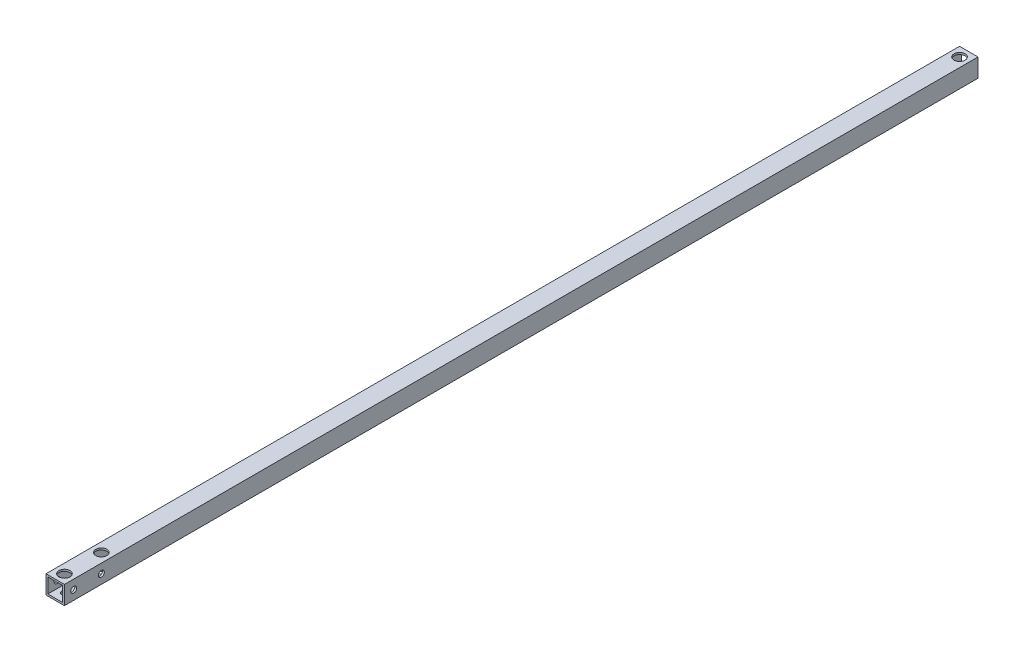
ISO-10303-21;
HEADER;
FILE_DESCRIPTION(('STEP AP214'),'2;1');
FILE_NAME('part.step','',(''),(''),'','','');
FILE_SCHEMA(('AUTOMOTIVE_DESIGN { 1 0 10303 214 1 1 1 1 }'));
ENDSEC;
DATA;
#1=APPLICATION_CONTEXT('core data for automotive mechanical design processes');
#2=APPLICATION_PROTOCOL_DEFINITION('international standard','automotive_design',2000,#1);
#3=PRODUCT_CONTEXT('',#1,'mechanical');
#4=PRODUCT('Part','Part','',(#3));
#5=PRODUCT_RELATED_PRODUCT_CATEGORY('part','',(#4));
#6=PRODUCT_DEFINITION_FORMATION('','',#4);
#7=PRODUCT_DEFINITION_CONTEXT('part definition',#1,'design');
#8=PRODUCT_DEFINITION('design','',#6,#7);
#9=PRODUCT_DEFINITION_SHAPE('','',#8);
#10=(LENGTH_UNIT() NAMED_UNIT(*) SI_UNIT(.MILLI.,.METRE.));
#11=(NAMED_UNIT(*) PLANE_ANGLE_UNIT() SI_UNIT($,.RADIAN.));
#12=(NAMED_UNIT(*) SI_UNIT($,.STERADIAN.) SOLID_ANGLE_UNIT());
#13=UNCERTAINTY_MEASURE_WITH_UNIT(LENGTH_MEASURE(1.E-05),#10,'distance_accuracy_value','');
#14=(GEOMETRIC_REPRESENTATION_CONTEXT(3) GLOBAL_UNCERTAINTY_ASSIGNED_CONTEXT((#13)) GLOBAL_UNIT_ASSIGNED_CONTEXT((#10,
#11,#12)) REPRESENTATION_CONTEXT('',''));
#15=CARTESIAN_POINT('',(0.,0.,0.));
#16=DIRECTION('',(0.,0.,1.));
#17=DIRECTION('',(1.,0.,0.));
#18=AXIS2_PLACEMENT_3D('',#15,#16,#17);
#19=CARTESIAN_POINT('',(0.,0.,495.));
#20=DIRECTION('',(0.,0.,1.));
#21=DIRECTION('',(1.,0.,0.));
#22=AXIS2_PLACEMENT_3D('',#19,#20,#21);
#23=PLANE('',#22);
#24=DIRECTION('',(0.,-1.,0.));
#25=VECTOR('',#24,1.);
#26=CARTESIAN_POINT('',(-5.,5.,495.));
#27=LINE('',#26,#25);
#28=CARTESIAN_POINT('',(-5.,5.,495.));
#29=VERTEX_POINT('',#28);
#30=CARTESIAN_POINT('',(-5.,-5.,495.));
#31=VERTEX_POINT('',#30);
#32=EDGE_CURVE('E166',#29,#31,#27,.T.);
#33=ORIENTED_EDGE('',*,*,#32,.T.);
#34=DIRECTION('',(1.,0.,0.));
#35=VECTOR('',#34,1.);
#36=CARTESIAN_POINT('',(5.,-5.,495.));
#37=LINE('',#36,#35);
#38=CARTESIAN_POINT('',(5.,-5.,495.));
#39=VERTEX_POINT('',#38);
#40=EDGE_CURVE('E169',#31,#39,#37,.T.);
#41=ORIENTED_EDGE('',*,*,#40,.T.);
#42=DIRECTION('',(0.,1.,0.));
#43=VECTOR('',#42,1.);
#44=CARTESIAN_POINT('',(5.,5.,495.));
#45=LINE('',#44,#43);
#46=CARTESIAN_POINT('',(5.,5.,495.));
#47=VERTEX_POINT('',#46);
#48=EDGE_CURVE('E172',#39,#47,#45,.T.);
#49=ORIENTED_EDGE('',*,*,#48,.T.);
#50=DIRECTION('',(-1.,0.,0.));
#51=VECTOR('',#50,1.);
#52=CARTESIAN_POINT('',(5.,5.,495.));
#53=LINE('',#52,#51);
#54=EDGE_CURVE('E174',#47,#29,#53,.T.);
#55=ORIENTED_EDGE('',*,*,#54,.T.);
#56=EDGE_LOOP('',(#33,#41,#49,#55));
#57=FACE_BOUND('',#56,.T.);
#58=DIRECTION('',(1.,0.,0.));
#59=VECTOR('',#58,1.);
#60=CARTESIAN_POINT('',(0.,-4.,495.));
#61=LINE('',#60,#59);
#62=CARTESIAN_POINT('',(-4.,-4.,495.));
#63=VERTEX_POINT('',#62);
#64=CARTESIAN_POINT('',(4.,-4.,495.));
#65=VERTEX_POINT('',#64);
#66=EDGE_CURVE('E136',#63,#65,#61,.T.);
#67=ORIENTED_EDGE('',*,*,#66,.F.);
#68=DIRECTION('',(0.,-1.,0.));
#69=VECTOR('',#68,1.);
#70=CARTESIAN_POINT('',(-4.,0.,495.));
#71=LINE('',#70,#69);
#72=CARTESIAN_POINT('',(-4.,4.,495.));
#73=VERTEX_POINT('',#72);
#74=EDGE_CURVE('E128',#73,#63,#71,.T.);
#75=ORIENTED_EDGE('',*,*,#74,.F.);
#76=DIRECTION('',(-1.,0.,0.));
#77=VECTOR('',#76,1.);
#78=CARTESIAN_POINT('',(0.,4.,495.));
#79=LINE('',#78,#77);
#80=CARTESIAN_POINT('',(4.,4.,495.));
#81=VERTEX_POINT('',#80);
#82=EDGE_CURVE('E150',#81,#73,#79,.T.);
#83=ORIENTED_EDGE('',*,*,#82,.F.);
#84=DIRECTION('',(0.,1.,0.));
#85=VECTOR('',#84,1.);
#86=CARTESIAN_POINT('',(4.,0.,495.));
#87=LINE('',#86,#85);
#88=EDGE_CURVE('E148',#65,#81,#87,.T.);
#89=ORIENTED_EDGE('',*,*,#88,.F.);
#90=EDGE_LOOP('',(#67,#75,#83,#89));
#91=FACE_BOUND('',#90,.T.);
#92=ADVANCED_FACE('F61',(#57,#91),#23,.T.);
#93=CARTESIAN_POINT('',(0.,0.,0.));
#94=DIRECTION('',(0.,0.,1.));
#95=DIRECTION('',(1.,0.,0.));
#96=AXIS2_PLACEMENT_3D('',#93,#94,#95);
#97=PLANE('',#96);
#98=DIRECTION('',(0.,-1.,0.));
#99=VECTOR('',#98,1.);
#100=CARTESIAN_POINT('',(-5.,5.,0.));
#101=LINE('',#100,#99);
#102=CARTESIAN_POINT('',(-5.,5.,0.));
#103=VERTEX_POINT('',#102);
#104=CARTESIAN_POINT('',(-5.,-5.,0.));
#105=VERTEX_POINT('',#104);
#106=EDGE_CURVE('E144',#103,#105,#101,.T.);
#107=ORIENTED_EDGE('',*,*,#106,.F.);
#108=DIRECTION('',(-1.,0.,0.));
#109=VECTOR('',#108,1.);
#110=CARTESIAN_POINT('',(5.,5.,0.));
#111=LINE('',#110,#109);
#112=CARTESIAN_POINT('',(5.,5.,0.));
#113=VERTEX_POINT('',#112);
#114=EDGE_CURVE('E170',#113,#103,#111,.T.);
#115=ORIENTED_EDGE('',*,*,#114,.F.);
#116=DIRECTION('',(0.,1.,0.));
#117=VECTOR('',#116,1.);
#118=CARTESIAN_POINT('',(5.,5.,0.));
#119=LINE('',#118,#117);
#120=CARTESIAN_POINT('',(5.,-5.,0.));
#121=VERTEX_POINT('',#120);
#122=EDGE_CURVE('E181',#121,#113,#119,.T.);
#123=ORIENTED_EDGE('',*,*,#122,.F.);
#124=DIRECTION('',(1.,0.,0.));
#125=VECTOR('',#124,1.);
#126=CARTESIAN_POINT('',(5.,-5.,0.));
#127=LINE('',#126,#125);
#128=EDGE_CURVE('E179',#105,#121,#127,.T.);
#129=ORIENTED_EDGE('',*,*,#128,.F.);
#130=EDGE_LOOP('',(#107,#115,#123,#129));
#131=FACE_BOUND('',#130,.T.);
#132=DIRECTION('',(0.,-1.,0.));
#133=VECTOR('',#132,1.);
#134=CARTESIAN_POINT('',(-4.,0.,0.));
#135=LINE('',#134,#133);
#136=CARTESIAN_POINT('',(-4.,4.,0.));
#137=VERTEX_POINT('',#136);
#138=CARTESIAN_POINT('',(-4.,-4.,0.));
#139=VERTEX_POINT('',#138);
#140=EDGE_CURVE('E86',#137,#139,#135,.T.);
#141=ORIENTED_EDGE('',*,*,#140,.T.);
#142=DIRECTION('',(1.,0.,0.));
#143=VECTOR('',#142,1.);
#144=CARTESIAN_POINT('',(0.,-4.,0.));
#145=LINE('',#144,#143);
#146=CARTESIAN_POINT('',(4.,-4.,0.));
#147=VERTEX_POINT('',#146);
#148=EDGE_CURVE('E143',#139,#147,#145,.T.);
#149=ORIENTED_EDGE('',*,*,#148,.T.);
#150=DIRECTION('',(0.,1.,0.));
#151=VECTOR('',#150,1.);
#152=CARTESIAN_POINT('',(4.,0.,0.));
#153=LINE('',#152,#151);
#154=CARTESIAN_POINT('',(4.,4.,0.));
#155=VERTEX_POINT('',#154);
#156=EDGE_CURVE('E158',#147,#155,#153,.T.);
#157=ORIENTED_EDGE('',*,*,#156,.T.);
#158=DIRECTION('',(-1.,0.,0.));
#159=VECTOR('',#158,1.);
#160=CARTESIAN_POINT('',(0.,4.,0.));
#161=LINE('',#160,#159);
#162=EDGE_CURVE('E137',#155,#137,#161,.T.);
#163=ORIENTED_EDGE('',*,*,#162,.T.);
#164=EDGE_LOOP('',(#141,#149,#157,#163));
#165=FACE_BOUND('',#164,.T.);
#166=ADVANCED_FACE('F283',(#131,#165),#97,.F.);
#167=CARTESIAN_POINT('',(-5.,5.,495.));
#168=DIRECTION('',(1.,0.,0.));
#169=DIRECTION('',(0.,1.,0.));
#170=AXIS2_PLACEMENT_3D('',#167,#168,#169);
#171=PLANE('',#170);
#172=CARTESIAN_POINT('',(-5.,0.,490.));
#173=DIRECTION('',(1.,0.,0.));
#174=DIRECTION('',(0.,1.,0.));
#175=AXIS2_PLACEMENT_3D('',#172,#173,#174);
#176=CIRCLE('',#175,1.59999999999996);
#177=CARTESIAN_POINT('',(-5.,1.59999999999996,490.));
#178=VERTEX_POINT('',#177);
#179=EDGE_CURVE('E193',#178,#178,#176,.T.);
#180=ORIENTED_EDGE('',*,*,#179,.T.);
#181=EDGE_LOOP('',(#180));
#182=FACE_BOUND('',#181,.T.);
#183=CARTESIAN_POINT('',(-5.,0.,475.));
#184=DIRECTION('',(1.,0.,0.));
#185=DIRECTION('',(0.,1.,0.));
#186=AXIS2_PLACEMENT_3D('',#183,#184,#185);
#187=CIRCLE('',#186,1.59999999999996);
#188=CARTESIAN_POINT('',(-5.,1.59999999999996,475.));
#189=VERTEX_POINT('',#188);
#190=EDGE_CURVE('E204',#189,#189,#187,.T.);
#191=ORIENTED_EDGE('',*,*,#190,.T.);
#192=EDGE_LOOP('',(#191));
#193=FACE_BOUND('',#192,.T.);
#194=ORIENTED_EDGE('',*,*,#106,.T.);
#195=DIRECTION('',(0.,0.,-1.));
#196=VECTOR('',#195,1.);
#197=CARTESIAN_POINT('',(-5.,-5.,495.));
#198=LINE('',#197,#196);
#199=EDGE_CURVE('E12',#31,#105,#198,.T.);
#200=ORIENTED_EDGE('',*,*,#199,.F.);
#201=ORIENTED_EDGE('',*,*,#32,.F.);
#202=DIRECTION('',(0.,0.,-1.));
#203=VECTOR('',#202,1.);
#204=CARTESIAN_POINT('',(-5.,5.,495.));
#205=LINE('',#204,#203);
#206=EDGE_CURVE('E176',#29,#103,#205,.T.);
#207=ORIENTED_EDGE('',*,*,#206,.T.);
#208=EDGE_LOOP('',(#194,#200,#201,#207));
#209=FACE_BOUND('',#208,.T.);
#210=ADVANCED_FACE('F63',(#182,#193,#209),#171,.F.);
#211=CARTESIAN_POINT('',(5.,-5.,495.));
#212=DIRECTION('',(0.,1.,0.));
#213=DIRECTION('',(-1.,0.,0.));
#214=AXIS2_PLACEMENT_3D('',#211,#212,#213);
#215=PLANE('',#214);
#216=CARTESIAN_POINT('',(0.,-5.00000000000001,5.));
#217=DIRECTION('',(0.,1.,0.));
#218=DIRECTION('',(-1.,0.,0.));
#219=AXIS2_PLACEMENT_3D('',#216,#217,#218);
#220=CIRCLE('',#219,1.6);
#221=CARTESIAN_POINT('',(-1.6,-5.00000000000001,5.));
#222=VERTEX_POINT('',#221);
#223=EDGE_CURVE('E234',#222,#222,#220,.T.);
#224=ORIENTED_EDGE('',*,*,#223,.T.);
#225=EDGE_LOOP('',(#224));
#226=FACE_BOUND('',#225,.T.);
#227=CARTESIAN_POINT('',(0.,-5.00000000000001,490.));
#228=DIRECTION('',(0.,1.,0.));
#229=DIRECTION('',(-1.,0.,0.));
#230=AXIS2_PLACEMENT_3D('',#227,#228,#229);
#231=CIRCLE('',#230,1.59999999999999);
#232=CARTESIAN_POINT('',(-1.59999999999993,-5.00000000000001,490.));
#233=VERTEX_POINT('',#232);
#234=EDGE_CURVE('E238',#233,#233,#231,.T.);
#235=ORIENTED_EDGE('',*,*,#234,.T.);
#236=EDGE_LOOP('',(#235));
#237=FACE_BOUND('',#236,.T.);
#238=CARTESIAN_POINT('',(0.,-5.00000000000001,470.));
#239=DIRECTION('',(0.,1.,0.));
#240=DIRECTION('',(-1.,0.,0.));
#241=AXIS2_PLACEMENT_3D('',#238,#239,#240);
#242=CIRCLE('',#241,1.59999999999999);
#243=CARTESIAN_POINT('',(-1.59999999999993,-5.00000000000001,470.));
#244=VERTEX_POINT('',#243);
#245=EDGE_CURVE('E219',#244,#244,#242,.T.);
#246=ORIENTED_EDGE('',*,*,#245,.T.);
#247=EDGE_LOOP('',(#246));
#248=FACE_BOUND('',#247,.T.);
#249=ORIENTED_EDGE('',*,*,#128,.T.);
#250=DIRECTION('',(0.,0.,-1.));
#251=VECTOR('',#250,1.);
#252=CARTESIAN_POINT('',(5.,-5.,495.));
#253=LINE('',#252,#251);
#254=EDGE_CURVE('E70',#39,#121,#253,.T.);
#255=ORIENTED_EDGE('',*,*,#254,.F.);
#256=ORIENTED_EDGE('',*,*,#40,.F.);
#257=ORIENTED_EDGE('',*,*,#199,.T.);
#258=EDGE_LOOP('',(#249,#255,#256,#257));
#259=FACE_BOUND('',#258,.T.);
#260=ADVANCED_FACE('F269',(#226,#237,#248,#259),#215,.F.);
#261=CARTESIAN_POINT('',(5.,5.,495.));
#262=DIRECTION('',(-1.,0.,0.));
#263=DIRECTION('',(0.,-1.,0.));
#264=AXIS2_PLACEMENT_3D('',#261,#262,#263);
#265=PLANE('',#264);
#266=CARTESIAN_POINT('',(5.,0.,490.));
#267=DIRECTION('',(1.,0.,0.));
#268=DIRECTION('',(0.,1.,0.));
#269=AXIS2_PLACEMENT_3D('',#266,#267,#268);
#270=CIRCLE('',#269,1.59999999999996);
#271=CARTESIAN_POINT('',(5.,1.59999999999997,490.));
#272=VERTEX_POINT('',#271);
#273=EDGE_CURVE('E199',#272,#272,#270,.T.);
#274=ORIENTED_EDGE('',*,*,#273,.F.);
#275=EDGE_LOOP('',(#274));
#276=FACE_BOUND('',#275,.T.);
#277=CARTESIAN_POINT('',(5.,0.,475.));
#278=DIRECTION('',(1.,0.,0.));
#279=DIRECTION('',(0.,1.,0.));
#280=AXIS2_PLACEMENT_3D('',#277,#278,#279);
#281=CIRCLE('',#280,1.59999999999996);
#282=CARTESIAN_POINT('',(5.,1.59999999999997,475.));
#283=VERTEX_POINT('',#282);
#284=EDGE_CURVE('E209',#283,#283,#281,.T.);
#285=ORIENTED_EDGE('',*,*,#284,.F.);
#286=EDGE_LOOP('',(#285));
#287=FACE_BOUND('',#286,.T.);
#288=ORIENTED_EDGE('',*,*,#122,.T.);
#289=DIRECTION('',(0.,0.,-1.));
#290=VECTOR('',#289,1.);
#291=CARTESIAN_POINT('',(5.,5.,495.));
#292=LINE('',#291,#290);
#293=EDGE_CURVE('E186',#47,#113,#292,.T.);
#294=ORIENTED_EDGE('',*,*,#293,.F.);
#295=ORIENTED_EDGE('',*,*,#48,.F.);
#296=ORIENTED_EDGE('',*,*,#254,.T.);
#297=EDGE_LOOP('',(#288,#294,#295,#296));
#298=FACE_BOUND('',#297,.T.);
#299=ADVANCED_FACE('F272',(#276,#287,#298),#265,.F.);
#300=CARTESIAN_POINT('',(5.,5.,495.));
#301=DIRECTION('',(0.,-1.,0.));
#302=DIRECTION('',(1.,0.,0.));
#303=AXIS2_PLACEMENT_3D('',#300,#301,#302);
#304=PLANE('',#303);
#305=CARTESIAN_POINT('',(0.,5.,5.));
#306=DIRECTION('',(0.,1.,0.));
#307=DIRECTION('',(-1.,0.,0.));
#308=AXIS2_PLACEMENT_3D('',#305,#306,#307);
#309=CIRCLE('',#308,3.);
#310=CARTESIAN_POINT('',(-3.,5.,5.));
#311=VERTEX_POINT('',#310);
#312=EDGE_CURVE('E216',#311,#311,#309,.T.);
#313=ORIENTED_EDGE('',*,*,#312,.F.);
#314=EDGE_LOOP('',(#313));
#315=FACE_BOUND('',#314,.T.);
#316=CARTESIAN_POINT('',(0.,5.,490.));
#317=DIRECTION('',(0.,1.,0.));
#318=DIRECTION('',(-1.,0.,0.));
#319=AXIS2_PLACEMENT_3D('',#316,#317,#318);
#320=CIRCLE('',#319,3.);
#321=CARTESIAN_POINT('',(-2.99999999999994,5.,490.));
#322=VERTEX_POINT('',#321);
#323=EDGE_CURVE('E223',#322,#322,#320,.T.);
#324=ORIENTED_EDGE('',*,*,#323,.F.);
#325=EDGE_LOOP('',(#324));
#326=FACE_BOUND('',#325,.T.);
#327=CARTESIAN_POINT('',(0.,5.,470.));
#328=DIRECTION('',(0.,1.,0.));
#329=DIRECTION('',(-1.,0.,0.));
#330=AXIS2_PLACEMENT_3D('',#327,#328,#329);
#331=CIRCLE('',#330,3.);
#332=CARTESIAN_POINT('',(-2.99999999999995,5.,470.));
#333=VERTEX_POINT('',#332);
#334=EDGE_CURVE('E229',#333,#333,#331,.T.);
#335=ORIENTED_EDGE('',*,*,#334,.F.);
#336=EDGE_LOOP('',(#335));
#337=FACE_BOUND('',#336,.T.);
#338=ORIENTED_EDGE('',*,*,#114,.T.);
#339=ORIENTED_EDGE('',*,*,#206,.F.);
#340=ORIENTED_EDGE('',*,*,#54,.F.);
#341=ORIENTED_EDGE('',*,*,#293,.T.);
#342=EDGE_LOOP('',(#338,#339,#340,#341));
#343=FACE_BOUND('',#342,.T.);
#344=ADVANCED_FACE('F287',(#315,#326,#337,#343),#304,.F.);
#345=CARTESIAN_POINT('',(-4.,0.,495.));
#346=DIRECTION('',(1.,0.,0.));
#347=DIRECTION('',(0.,1.,0.));
#348=AXIS2_PLACEMENT_3D('',#345,#346,#347);
#349=PLANE('',#348);
#350=CARTESIAN_POINT('',(-4.,0.,490.));
#351=DIRECTION('',(1.,0.,0.));
#352=DIRECTION('',(0.,1.,0.));
#353=AXIS2_PLACEMENT_3D('',#350,#351,#352);
#354=CIRCLE('',#353,1.59999999999996);
#355=CARTESIAN_POINT('',(-4.,1.59999999999996,490.));
#356=VERTEX_POINT('',#355);
#357=EDGE_CURVE('E212',#356,#356,#354,.T.);
#358=ORIENTED_EDGE('',*,*,#357,.F.);
#359=EDGE_LOOP('',(#358));
#360=FACE_BOUND('',#359,.T.);
#361=CARTESIAN_POINT('',(-4.,0.,475.));
#362=DIRECTION('',(1.,0.,0.));
#363=DIRECTION('',(0.,1.,0.));
#364=AXIS2_PLACEMENT_3D('',#361,#362,#363);
#365=CIRCLE('',#364,1.59999999999996);
#366=CARTESIAN_POINT('',(-4.,1.59999999999996,475.));
#367=VERTEX_POINT('',#366);
#368=EDGE_CURVE('E192',#367,#367,#365,.T.);
#369=ORIENTED_EDGE('',*,*,#368,.F.);
#370=EDGE_LOOP('',(#369));
#371=FACE_BOUND('',#370,.T.);
#372=ORIENTED_EDGE('',*,*,#140,.F.);
#373=DIRECTION('',(0.,0.,-1.));
#374=VECTOR('',#373,1.);
#375=CARTESIAN_POINT('',(-4.,4.,495.));
#376=LINE('',#375,#374);
#377=EDGE_CURVE('E132',#73,#137,#376,.T.);
#378=ORIENTED_EDGE('',*,*,#377,.F.);
#379=ORIENTED_EDGE('',*,*,#74,.T.);
#380=DIRECTION('',(0.,0.,-1.));
#381=VECTOR('',#380,1.);
#382=CARTESIAN_POINT('',(-4.,-4.,495.));
#383=LINE('',#382,#381);
#384=EDGE_CURVE('E131',#63,#139,#383,.T.);
#385=ORIENTED_EDGE('',*,*,#384,.T.);
#386=EDGE_LOOP('',(#372,#378,#379,#385));
#387=FACE_BOUND('',#386,.T.);
#388=ADVANCED_FACE('F130',(#360,#371,#387),#349,.T.);
#389=CARTESIAN_POINT('',(0.,-4.,495.));
#390=DIRECTION('',(0.,1.,0.));
#391=DIRECTION('',(-1.,0.,0.));
#392=AXIS2_PLACEMENT_3D('',#389,#390,#391);
#393=PLANE('',#392);
#394=CARTESIAN_POINT('',(0.,-4.,5.));
#395=DIRECTION('',(0.,1.,0.));
#396=DIRECTION('',(-1.,0.,0.));
#397=AXIS2_PLACEMENT_3D('',#394,#395,#396);
#398=CIRCLE('',#397,1.6);
#399=CARTESIAN_POINT('',(-1.6,-4.,5.));
#400=VERTEX_POINT('',#399);
#401=EDGE_CURVE('E156',#400,#400,#398,.T.);
#402=ORIENTED_EDGE('',*,*,#401,.F.);
#403=EDGE_LOOP('',(#402));
#404=FACE_BOUND('',#403,.T.);
#405=CARTESIAN_POINT('',(0.,-4.,490.));
#406=DIRECTION('',(0.,1.,0.));
#407=DIRECTION('',(-1.,0.,0.));
#408=AXIS2_PLACEMENT_3D('',#405,#406,#407);
#409=CIRCLE('',#408,1.59999999999999);
#410=CARTESIAN_POINT('',(-1.59999999999993,-4.,490.));
#411=VERTEX_POINT('',#410);
#412=EDGE_CURVE('E245',#411,#411,#409,.T.);
#413=ORIENTED_EDGE('',*,*,#412,.F.);
#414=EDGE_LOOP('',(#413));
#415=FACE_BOUND('',#414,.T.);
#416=CARTESIAN_POINT('',(0.,-4.,470.));
#417=DIRECTION('',(0.,1.,0.));
#418=DIRECTION('',(-1.,0.,0.));
#419=AXIS2_PLACEMENT_3D('',#416,#417,#418);
#420=CIRCLE('',#419,1.59999999999999);
#421=CARTESIAN_POINT('',(-1.59999999999993,-4.,470.));
#422=VERTEX_POINT('',#421);
#423=EDGE_CURVE('E237',#422,#422,#420,.T.);
#424=ORIENTED_EDGE('',*,*,#423,.F.);
#425=EDGE_LOOP('',(#424));
#426=FACE_BOUND('',#425,.T.);
#427=ORIENTED_EDGE('',*,*,#148,.F.);
#428=ORIENTED_EDGE('',*,*,#384,.F.);
#429=ORIENTED_EDGE('',*,*,#66,.T.);
#430=DIRECTION('',(0.,0.,-1.));
#431=VECTOR('',#430,1.);
#432=CARTESIAN_POINT('',(4.,-4.,495.));
#433=LINE('',#432,#431);
#434=EDGE_CURVE('E145',#65,#147,#433,.T.);
#435=ORIENTED_EDGE('',*,*,#434,.T.);
#436=EDGE_LOOP('',(#427,#428,#429,#435));
#437=FACE_BOUND('',#436,.T.);
#438=ADVANCED_FACE('F140',(#404,#415,#426,#437),#393,.T.);
#439=CARTESIAN_POINT('',(4.,0.,495.));
#440=DIRECTION('',(-1.,0.,0.));
#441=DIRECTION('',(0.,-1.,0.));
#442=AXIS2_PLACEMENT_3D('',#439,#440,#441);
#443=PLANE('',#442);
#444=CARTESIAN_POINT('',(4.,0.,490.));
#445=DIRECTION('',(-1.,0.,0.));
#446=DIRECTION('',(0.,-1.,0.));
#447=AXIS2_PLACEMENT_3D('',#444,#445,#446);
#448=CIRCLE('',#447,1.59999999999996);
#449=CARTESIAN_POINT('',(4.,-1.59999999999996,490.));
#450=VERTEX_POINT('',#449);
#451=EDGE_CURVE('E65',#450,#450,#448,.T.);
#452=ORIENTED_EDGE('',*,*,#451,.F.);
#453=EDGE_LOOP('',(#452));
#454=FACE_BOUND('',#453,.T.);
#455=CARTESIAN_POINT('',(4.,0.,475.));
#456=DIRECTION('',(-1.,0.,0.));
#457=DIRECTION('',(0.,-1.,0.));
#458=AXIS2_PLACEMENT_3D('',#455,#456,#457);
#459=CIRCLE('',#458,1.59999999999996);
#460=CARTESIAN_POINT('',(4.,-1.59999999999996,475.));
#461=VERTEX_POINT('',#460);
#462=EDGE_CURVE('E190',#461,#461,#459,.T.);
#463=ORIENTED_EDGE('',*,*,#462,.F.);
#464=EDGE_LOOP('',(#463));
#465=FACE_BOUND('',#464,.T.);
#466=ORIENTED_EDGE('',*,*,#156,.F.);
#467=ORIENTED_EDGE('',*,*,#434,.F.);
#468=ORIENTED_EDGE('',*,*,#88,.T.);
#469=DIRECTION('',(0.,0.,-1.));
#470=VECTOR('',#469,1.);
#471=CARTESIAN_POINT('',(4.,4.,495.));
#472=LINE('',#471,#470);
#473=EDGE_CURVE('E78',#81,#155,#472,.T.);
#474=ORIENTED_EDGE('',*,*,#473,.T.);
#475=EDGE_LOOP('',(#466,#467,#468,#474));
#476=FACE_BOUND('',#475,.T.);
#477=ADVANCED_FACE('F255',(#454,#465,#476),#443,.T.);
#478=CARTESIAN_POINT('',(0.,4.,495.));
#479=DIRECTION('',(0.,-1.,0.));
#480=DIRECTION('',(1.,0.,0.));
#481=AXIS2_PLACEMENT_3D('',#478,#479,#480);
#482=PLANE('',#481);
#483=CARTESIAN_POINT('',(0.,4.,5.));
#484=DIRECTION('',(0.,-1.,0.));
#485=DIRECTION('',(1.,0.,0.));
#486=AXIS2_PLACEMENT_3D('',#483,#484,#485);
#487=CIRCLE('',#486,3.);
#488=CARTESIAN_POINT('',(3.,4.,5.));
#489=VERTEX_POINT('',#488);
#490=EDGE_CURVE('E220',#489,#489,#487,.F.);
#491=ORIENTED_EDGE('',*,*,#490,.T.);
#492=EDGE_LOOP('',(#491));
#493=FACE_BOUND('',#492,.T.);
#494=CARTESIAN_POINT('',(0.,4.,490.));
#495=DIRECTION('',(0.,-1.,0.));
#496=DIRECTION('',(1.,0.,0.));
#497=AXIS2_PLACEMENT_3D('',#494,#495,#496);
#498=CIRCLE('',#497,3.);
#499=CARTESIAN_POINT('',(3.00000000000006,4.,490.));
#500=VERTEX_POINT('',#499);
#501=EDGE_CURVE('E226',#500,#500,#498,.F.);
#502=ORIENTED_EDGE('',*,*,#501,.T.);
#503=EDGE_LOOP('',(#502));
#504=FACE_BOUND('',#503,.T.);
#505=CARTESIAN_POINT('',(0.,4.,470.));
#506=DIRECTION('',(0.,-1.,0.));
#507=DIRECTION('',(1.,0.,0.));
#508=AXIS2_PLACEMENT_3D('',#505,#506,#507);
#509=CIRCLE('',#508,3.);
#510=CARTESIAN_POINT('',(3.00000000000006,4.,470.));
#511=VERTEX_POINT('',#510);
#512=EDGE_CURVE('E215',#511,#511,#509,.F.);
#513=ORIENTED_EDGE('',*,*,#512,.T.);
#514=EDGE_LOOP('',(#513));
#515=FACE_BOUND('',#514,.T.);
#516=ORIENTED_EDGE('',*,*,#162,.F.);
#517=ORIENTED_EDGE('',*,*,#473,.F.);
#518=ORIENTED_EDGE('',*,*,#82,.T.);
#519=ORIENTED_EDGE('',*,*,#377,.T.);
#520=EDGE_LOOP('',(#516,#517,#518,#519));
#521=FACE_BOUND('',#520,.T.);
#522=ADVANCED_FACE('F265',(#493,#504,#515,#521),#482,.T.);
#523=CARTESIAN_POINT('',(0.,-5.00000000000001,470.));
#524=DIRECTION('',(0.,1.,0.));
#525=DIRECTION('',(-1.,0.,0.));
#526=AXIS2_PLACEMENT_3D('',#523,#524,#525);
#527=CYLINDRICAL_SURFACE('',#526,1.59999999999999);
#528=CARTESIAN_POINT('',(-1.59999999999993,-4.,470.));
#529=CARTESIAN_POINT('',(-1.59999999999993,-4.01041666666667,470.));
#530=CARTESIAN_POINT('',(-1.59999999999993,-4.02083333333334,470.));
#531=CARTESIAN_POINT('',(-1.59999999999993,-4.04166666666667,470.));
#532=CARTESIAN_POINT('',(-1.59999999999993,-4.05208333333334,470.));
#533=CARTESIAN_POINT('',(-1.59999999999993,-4.07291666666667,470.));
#534=CARTESIAN_POINT('',(-1.59999999999993,-4.08333333333334,470.));
#535=CARTESIAN_POINT('',(-1.59999999999993,-4.10416666666667,470.));
#536=CARTESIAN_POINT('',(-1.59999999999993,-4.11458333333334,470.));
#537=CARTESIAN_POINT('',(-1.59999999999993,-4.13541666666667,470.));
#538=CARTESIAN_POINT('',(-1.59999999999993,-4.14583333333334,470.));
#539=CARTESIAN_POINT('',(-1.59999999999993,-4.16666666666667,470.));
#540=CARTESIAN_POINT('',(-1.59999999999993,-4.17708333333334,470.));
#541=CARTESIAN_POINT('',(-1.59999999999993,-4.19791666666667,470.));
#542=CARTESIAN_POINT('',(-1.59999999999993,-4.20833333333334,470.));
#543=CARTESIAN_POINT('',(-1.59999999999993,-4.22916666666667,470.));
#544=CARTESIAN_POINT('',(-1.59999999999993,-4.23958333333334,470.));
#545=CARTESIAN_POINT('',(-1.59999999999993,-4.26041666666667,470.));
#546=CARTESIAN_POINT('',(-1.59999999999993,-4.27083333333334,470.));
#547=CARTESIAN_POINT('',(-1.59999999999993,-4.29166666666667,470.));
#548=CARTESIAN_POINT('',(-1.59999999999993,-4.30208333333334,470.));
#549=CARTESIAN_POINT('',(-1.59999999999993,-4.32291666666667,470.));
#550=CARTESIAN_POINT('',(-1.59999999999993,-4.33333333333334,470.));
#551=CARTESIAN_POINT('',(-1.59999999999993,-4.35416666666667,470.));
#552=CARTESIAN_POINT('',(-1.59999999999993,-4.36458333333334,470.));
#553=CARTESIAN_POINT('',(-1.59999999999993,-4.38541666666667,470.));
#554=CARTESIAN_POINT('',(-1.59999999999993,-4.39583333333334,470.));
#555=CARTESIAN_POINT('',(-1.59999999999993,-4.41666666666667,470.));
#556=CARTESIAN_POINT('',(-1.59999999999993,-4.42708333333334,470.));
#557=CARTESIAN_POINT('',(-1.59999999999993,-4.44791666666667,470.));
#558=CARTESIAN_POINT('',(-1.59999999999993,-4.45833333333334,470.));
#559=CARTESIAN_POINT('',(-1.59999999999993,-4.47916666666667,470.));
#560=CARTESIAN_POINT('',(-1.59999999999993,-4.48958333333334,470.));
#561=CARTESIAN_POINT('',(-1.59999999999993,-4.51041666666667,470.));
#562=CARTESIAN_POINT('',(-1.59999999999993,-4.52083333333334,470.));
#563=CARTESIAN_POINT('',(-1.59999999999993,-4.54166666666667,470.));
#564=CARTESIAN_POINT('',(-1.59999999999993,-4.55208333333334,470.));
#565=CARTESIAN_POINT('',(-1.59999999999993,-4.57291666666667,470.));
#566=CARTESIAN_POINT('',(-1.59999999999993,-4.58333333333334,470.));
#567=CARTESIAN_POINT('',(-1.59999999999993,-4.60416666666667,470.));
#568=CARTESIAN_POINT('',(-1.59999999999993,-4.61458333333334,470.));
#569=CARTESIAN_POINT('',(-1.59999999999993,-4.63541666666667,470.));
#570=CARTESIAN_POINT('',(-1.59999999999993,-4.64583333333334,470.));
#571=CARTESIAN_POINT('',(-1.59999999999993,-4.66666666666667,470.));
#572=CARTESIAN_POINT('',(-1.59999999999993,-4.67708333333334,470.));
#573=CARTESIAN_POINT('',(-1.59999999999993,-4.69791666666667,470.));
#574=CARTESIAN_POINT('',(-1.59999999999993,-4.70833333333334,470.));
#575=CARTESIAN_POINT('',(-1.59999999999993,-4.72916666666667,470.));
#576=CARTESIAN_POINT('',(-1.59999999999993,-4.73958333333334,470.));
#577=CARTESIAN_POINT('',(-1.59999999999993,-4.76041666666667,470.));
#578=CARTESIAN_POINT('',(-1.59999999999993,-4.77083333333334,470.));
#579=CARTESIAN_POINT('',(-1.59999999999993,-4.79166666666667,470.));
#580=CARTESIAN_POINT('',(-1.59999999999993,-4.80208333333334,470.));
#581=CARTESIAN_POINT('',(-1.59999999999993,-4.82291666666667,470.));
#582=CARTESIAN_POINT('',(-1.59999999999993,-4.83333333333334,470.));
#583=CARTESIAN_POINT('',(-1.59999999999993,-4.85416666666667,470.));
#584=CARTESIAN_POINT('',(-1.59999999999993,-4.86458333333334,470.));
#585=CARTESIAN_POINT('',(-1.59999999999993,-4.88541666666667,470.));
#586=CARTESIAN_POINT('',(-1.59999999999993,-4.89583333333334,470.));
#587=CARTESIAN_POINT('',(-1.59999999999993,-4.91666666666667,470.));
#588=CARTESIAN_POINT('',(-1.59999999999993,-4.92708333333334,470.));
#589=CARTESIAN_POINT('',(-1.59999999999993,-4.94791666666667,470.));
#590=CARTESIAN_POINT('',(-1.59999999999993,-4.95833333333334,470.));
#591=CARTESIAN_POINT('',(-1.59999999999993,-4.97916666666667,470.));
#592=CARTESIAN_POINT('',(-1.59999999999993,-4.98958333333334,470.));
#593=CARTESIAN_POINT('',(-1.59999999999993,-5.00000000000001,470.));
#594=B_SPLINE_CURVE_WITH_KNOTS('',3,(#528,#529,#530,#531,#532,#533,#534,#535,#536,#537,#538,
#539,#540,#541,#542,#543,#544,#545,#546,#547,#548,#549,#550,#551,#552,#553,#554,#555,#556,#557,
#558,#559,#560,#561,#562,#563,#564,#565,#566,#567,#568,#569,#570,#571,#572,#573,#574,#575,#576,
#577,#578,#579,#580,#581,#582,#583,#584,#585,#586,#587,#588,#589,#590,#591,#592,#593),
.UNSPECIFIED.,.F.,.F.,(4,2,2,2,2,2,2,2,2,2,2,2,2,2,2,2,2,2,2,2,2,2,2,2,2,2,2,2,2,2,2,2,4),(0.,
0.03125,0.0625000000000001,0.0937500000000001,0.125,0.15625,0.1875,0.21875,0.25,
0.281250000000001,0.312500000000001,0.343750000000001,0.375000000000001,0.406250000000001,
0.437500000000001,0.468750000000001,0.500000000000001,0.531250000000001,0.562500000000001,
0.593750000000001,0.625000000000001,0.656250000000002,0.687500000000002,0.718750000000002,
0.750000000000002,0.781250000000002,0.812500000000002,0.843750000000002,0.875000000000003,
0.906250000000003,0.937500000000003,0.968750000000003,1.),.UNSPECIFIED.);
#595=EDGE_CURVE('BSEAM261',#422,#244,#594,.T.);
#596=ORIENTED_EDGE('',*,*,#423,.T.);
#597=ORIENTED_EDGE('',*,*,#245,.F.);
#598=ORIENTED_EDGE('',*,*,#595,.T.);
#599=ORIENTED_EDGE('',*,*,#595,.F.);
#600=EDGE_LOOP('',(#596,#598,#597,#599));
#601=FACE_BOUND('',#600,.T.);
#602=ADVANCED_FACE('F261',(#601),#527,.F.);
#603=CARTESIAN_POINT('',(0.,-5.00000000000001,490.));
#604=DIRECTION('',(0.,1.,0.));
#605=DIRECTION('',(-1.,0.,0.));
#606=AXIS2_PLACEMENT_3D('',#603,#604,#605);
#607=CYLINDRICAL_SURFACE('',#606,1.59999999999999);
#608=CARTESIAN_POINT('',(-1.59999999999993,-4.,490.));
#609=CARTESIAN_POINT('',(-1.59999999999993,-4.01041666666667,490.));
#610=CARTESIAN_POINT('',(-1.59999999999993,-4.02083333333334,490.));
#611=CARTESIAN_POINT('',(-1.59999999999993,-4.04166666666667,490.));
#612=CARTESIAN_POINT('',(-1.59999999999993,-4.05208333333334,490.));
#613=CARTESIAN_POINT('',(-1.59999999999993,-4.07291666666667,490.));
#614=CARTESIAN_POINT('',(-1.59999999999993,-4.08333333333334,490.));
#615=CARTESIAN_POINT('',(-1.59999999999993,-4.10416666666667,490.));
#616=CARTESIAN_POINT('',(-1.59999999999993,-4.11458333333334,490.));
#617=CARTESIAN_POINT('',(-1.59999999999993,-4.13541666666667,490.));
#618=CARTESIAN_POINT('',(-1.59999999999993,-4.14583333333334,490.));
#619=CARTESIAN_POINT('',(-1.59999999999993,-4.16666666666667,490.));
#620=CARTESIAN_POINT('',(-1.59999999999993,-4.17708333333334,490.));
#621=CARTESIAN_POINT('',(-1.59999999999993,-4.19791666666667,490.));
#622=CARTESIAN_POINT('',(-1.59999999999993,-4.20833333333334,490.));
#623=CARTESIAN_POINT('',(-1.59999999999993,-4.22916666666667,490.));
#624=CARTESIAN_POINT('',(-1.59999999999993,-4.23958333333334,490.));
#625=CARTESIAN_POINT('',(-1.59999999999993,-4.26041666666667,490.));
#626=CARTESIAN_POINT('',(-1.59999999999993,-4.27083333333334,490.));
#627=CARTESIAN_POINT('',(-1.59999999999993,-4.29166666666667,490.));
#628=CARTESIAN_POINT('',(-1.59999999999993,-4.30208333333334,490.));
#629=CARTESIAN_POINT('',(-1.59999999999993,-4.32291666666667,490.));
#630=CARTESIAN_POINT('',(-1.59999999999993,-4.33333333333334,490.));
#631=CARTESIAN_POINT('',(-1.59999999999993,-4.35416666666667,490.));
#632=CARTESIAN_POINT('',(-1.59999999999993,-4.36458333333334,490.));
#633=CARTESIAN_POINT('',(-1.59999999999993,-4.38541666666667,490.));
#634=CARTESIAN_POINT('',(-1.59999999999993,-4.39583333333334,490.));
#635=CARTESIAN_POINT('',(-1.59999999999993,-4.41666666666667,490.));
#636=CARTESIAN_POINT('',(-1.59999999999993,-4.42708333333334,490.));
#637=CARTESIAN_POINT('',(-1.59999999999993,-4.44791666666667,490.));
#638=CARTESIAN_POINT('',(-1.59999999999993,-4.45833333333334,490.));
#639=CARTESIAN_POINT('',(-1.59999999999993,-4.47916666666667,490.));
#640=CARTESIAN_POINT('',(-1.59999999999993,-4.48958333333334,490.));
#641=CARTESIAN_POINT('',(-1.59999999999993,-4.51041666666667,490.));
#642=CARTESIAN_POINT('',(-1.59999999999993,-4.52083333333334,490.));
#643=CARTESIAN_POINT('',(-1.59999999999993,-4.54166666666667,490.));
#644=CARTESIAN_POINT('',(-1.59999999999993,-4.55208333333334,490.));
#645=CARTESIAN_POINT('',(-1.59999999999993,-4.57291666666667,490.));
#646=CARTESIAN_POINT('',(-1.59999999999993,-4.58333333333334,490.));
#647=CARTESIAN_POINT('',(-1.59999999999993,-4.60416666666667,490.));
#648=CARTESIAN_POINT('',(-1.59999999999993,-4.61458333333334,490.));
#649=CARTESIAN_POINT('',(-1.59999999999993,-4.63541666666667,490.));
#650=CARTESIAN_POINT('',(-1.59999999999993,-4.64583333333334,490.));
#651=CARTESIAN_POINT('',(-1.59999999999993,-4.66666666666667,490.));
#652=CARTESIAN_POINT('',(-1.59999999999993,-4.67708333333334,490.));
#653=CARTESIAN_POINT('',(-1.59999999999993,-4.69791666666667,490.));
#654=CARTESIAN_POINT('',(-1.59999999999993,-4.70833333333334,490.));
#655=CARTESIAN_POINT('',(-1.59999999999993,-4.72916666666667,490.));
#656=CARTESIAN_POINT('',(-1.59999999999993,-4.73958333333334,490.));
#657=CARTESIAN_POINT('',(-1.59999999999993,-4.76041666666667,490.));
#658=CARTESIAN_POINT('',(-1.59999999999993,-4.77083333333334,490.));
#659=CARTESIAN_POINT('',(-1.59999999999993,-4.79166666666667,490.));
#660=CARTESIAN_POINT('',(-1.59999999999993,-4.80208333333334,490.));
#661=CARTESIAN_POINT('',(-1.59999999999993,-4.82291666666667,490.));
#662=CARTESIAN_POINT('',(-1.59999999999993,-4.83333333333334,490.));
#663=CARTESIAN_POINT('',(-1.59999999999993,-4.85416666666667,490.));
#664=CARTESIAN_POINT('',(-1.59999999999993,-4.86458333333334,490.));
#665=CARTESIAN_POINT('',(-1.59999999999993,-4.88541666666667,490.));
#666=CARTESIAN_POINT('',(-1.59999999999993,-4.89583333333334,490.));
#667=CARTESIAN_POINT('',(-1.59999999999993,-4.91666666666667,490.));
#668=CARTESIAN_POINT('',(-1.59999999999993,-4.92708333333334,490.));
#669=CARTESIAN_POINT('',(-1.59999999999993,-4.94791666666667,490.));
#670=CARTESIAN_POINT('',(-1.59999999999993,-4.95833333333334,490.));
#671=CARTESIAN_POINT('',(-1.59999999999993,-4.97916666666667,490.));
#672=CARTESIAN_POINT('',(-1.59999999999993,-4.98958333333334,490.));
#673=CARTESIAN_POINT('',(-1.59999999999993,-5.00000000000001,490.));
#674=B_SPLINE_CURVE_WITH_KNOTS('',3,(#608,#609,#610,#611,#612,#613,#614,#615,#616,#617,#618,
#619,#620,#621,#622,#623,#624,#625,#626,#627,#628,#629,#630,#631,#632,#633,#634,#635,#636,#637,
#638,#639,#640,#641,#642,#643,#644,#645,#646,#647,#648,#649,#650,#651,#652,#653,#654,#655,#656,
#657,#658,#659,#660,#661,#662,#663,#664,#665,#666,#667,#668,#669,#670,#671,#672,#673),
.UNSPECIFIED.,.F.,.F.,(4,2,2,2,2,2,2,2,2,2,2,2,2,2,2,2,2,2,2,2,2,2,2,2,2,2,2,2,2,2,2,2,4),(0.,
0.03125,0.0625000000000001,0.0937500000000001,0.125,0.15625,0.1875,0.21875,0.25,
0.281250000000001,0.312500000000001,0.343750000000001,0.375000000000001,0.406250000000001,
0.437500000000001,0.468750000000001,0.500000000000001,0.531250000000001,0.562500000000001,
0.593750000000001,0.625000000000001,0.656250000000002,0.687500000000002,0.718750000000002,
0.750000000000002,0.781250000000002,0.812500000000002,0.843750000000002,0.875000000000003,
0.906250000000003,0.937500000000003,0.968750000000003,1.),.UNSPECIFIED.);
#675=EDGE_CURVE('BSEAM264',#411,#233,#674,.T.);
#676=ORIENTED_EDGE('',*,*,#412,.T.);
#677=ORIENTED_EDGE('',*,*,#234,.F.);
#678=ORIENTED_EDGE('',*,*,#675,.T.);
#679=ORIENTED_EDGE('',*,*,#675,.F.);
#680=EDGE_LOOP('',(#676,#678,#677,#679));
#681=FACE_BOUND('',#680,.T.);
#682=ADVANCED_FACE('F264',(#681),#607,.F.);
#683=CARTESIAN_POINT('',(0.,-5.00000000000001,5.));
#684=DIRECTION('',(0.,1.,0.));
#685=DIRECTION('',(-1.,0.,0.));
#686=AXIS2_PLACEMENT_3D('',#683,#684,#685);
#687=CYLINDRICAL_SURFACE('',#686,1.6);
#688=CARTESIAN_POINT('',(-1.6,-4.,5.));
#689=CARTESIAN_POINT('',(-1.6,-4.01041666666667,5.));
#690=CARTESIAN_POINT('',(-1.6,-4.02083333333334,5.));
#691=CARTESIAN_POINT('',(-1.6,-4.04166666666667,5.));
#692=CARTESIAN_POINT('',(-1.6,-4.05208333333334,5.));
#693=CARTESIAN_POINT('',(-1.6,-4.07291666666667,5.));
#694=CARTESIAN_POINT('',(-1.6,-4.08333333333334,5.));
#695=CARTESIAN_POINT('',(-1.6,-4.10416666666667,5.));
#696=CARTESIAN_POINT('',(-1.6,-4.11458333333334,5.));
#697=CARTESIAN_POINT('',(-1.6,-4.13541666666667,5.));
#698=CARTESIAN_POINT('',(-1.6,-4.14583333333334,5.));
#699=CARTESIAN_POINT('',(-1.6,-4.16666666666667,5.));
#700=CARTESIAN_POINT('',(-1.6,-4.17708333333334,5.));
#701=CARTESIAN_POINT('',(-1.6,-4.19791666666667,5.));
#702=CARTESIAN_POINT('',(-1.6,-4.20833333333334,5.));
#703=CARTESIAN_POINT('',(-1.6,-4.22916666666667,5.));
#704=CARTESIAN_POINT('',(-1.6,-4.23958333333334,5.));
#705=CARTESIAN_POINT('',(-1.6,-4.26041666666667,5.));
#706=CARTESIAN_POINT('',(-1.6,-4.27083333333334,5.));
#707=CARTESIAN_POINT('',(-1.6,-4.29166666666667,5.));
#708=CARTESIAN_POINT('',(-1.6,-4.30208333333334,5.));
#709=CARTESIAN_POINT('',(-1.6,-4.32291666666667,5.));
#710=CARTESIAN_POINT('',(-1.6,-4.33333333333334,5.));
#711=CARTESIAN_POINT('',(-1.6,-4.35416666666667,5.));
#712=CARTESIAN_POINT('',(-1.6,-4.36458333333334,5.));
#713=CARTESIAN_POINT('',(-1.6,-4.38541666666667,5.));
#714=CARTESIAN_POINT('',(-1.6,-4.39583333333334,5.));
#715=CARTESIAN_POINT('',(-1.6,-4.41666666666667,5.));
#716=CARTESIAN_POINT('',(-1.6,-4.42708333333334,5.));
#717=CARTESIAN_POINT('',(-1.6,-4.44791666666667,5.));
#718=CARTESIAN_POINT('',(-1.6,-4.45833333333334,5.));
#719=CARTESIAN_POINT('',(-1.6,-4.47916666666667,5.));
#720=CARTESIAN_POINT('',(-1.6,-4.48958333333334,5.));
#721=CARTESIAN_POINT('',(-1.6,-4.51041666666667,5.));
#722=CARTESIAN_POINT('',(-1.6,-4.52083333333334,5.));
#723=CARTESIAN_POINT('',(-1.6,-4.54166666666667,5.));
#724=CARTESIAN_POINT('',(-1.6,-4.55208333333334,5.));
#725=CARTESIAN_POINT('',(-1.6,-4.57291666666667,5.));
#726=CARTESIAN_POINT('',(-1.6,-4.58333333333334,5.));
#727=CARTESIAN_POINT('',(-1.6,-4.60416666666667,5.));
#728=CARTESIAN_POINT('',(-1.6,-4.61458333333334,5.));
#729=CARTESIAN_POINT('',(-1.6,-4.63541666666667,5.));
#730=CARTESIAN_POINT('',(-1.6,-4.64583333333334,5.));
#731=CARTESIAN_POINT('',(-1.6,-4.66666666666667,5.));
#732=CARTESIAN_POINT('',(-1.6,-4.67708333333334,5.));
#733=CARTESIAN_POINT('',(-1.6,-4.69791666666667,5.));
#734=CARTESIAN_POINT('',(-1.6,-4.70833333333334,5.));
#735=CARTESIAN_POINT('',(-1.6,-4.72916666666667,5.));
#736=CARTESIAN_POINT('',(-1.6,-4.73958333333334,5.));
#737=CARTESIAN_POINT('',(-1.6,-4.76041666666667,5.));
#738=CARTESIAN_POINT('',(-1.6,-4.77083333333334,5.));
#739=CARTESIAN_POINT('',(-1.6,-4.79166666666667,5.));
#740=CARTESIAN_POINT('',(-1.6,-4.80208333333334,5.));
#741=CARTESIAN_POINT('',(-1.6,-4.82291666666667,5.));
#742=CARTESIAN_POINT('',(-1.6,-4.83333333333334,5.));
#743=CARTESIAN_POINT('',(-1.6,-4.85416666666667,5.));
#744=CARTESIAN_POINT('',(-1.6,-4.86458333333334,5.));
#745=CARTESIAN_POINT('',(-1.6,-4.88541666666667,5.));
#746=CARTESIAN_POINT('',(-1.6,-4.89583333333334,5.));
#747=CARTESIAN_POINT('',(-1.6,-4.91666666666667,5.));
#748=CARTESIAN_POINT('',(-1.6,-4.92708333333334,5.));
#749=CARTESIAN_POINT('',(-1.6,-4.94791666666667,5.));
#750=CARTESIAN_POINT('',(-1.6,-4.95833333333334,5.));
#751=CARTESIAN_POINT('',(-1.6,-4.97916666666667,5.));
#752=CARTESIAN_POINT('',(-1.6,-4.98958333333334,5.));
#753=CARTESIAN_POINT('',(-1.6,-5.00000000000001,5.));
#754=B_SPLINE_CURVE_WITH_KNOTS('',3,(#688,#689,#690,#691,#692,#693,#694,#695,#696,#697,#698,
#699,#700,#701,#702,#703,#704,#705,#706,#707,#708,#709,#710,#711,#712,#713,#714,#715,#716,#717,
#718,#719,#720,#721,#722,#723,#724,#725,#726,#727,#728,#729,#730,#731,#732,#733,#734,#735,#736,
#737,#738,#739,#740,#741,#742,#743,#744,#745,#746,#747,#748,#749,#750,#751,#752,#753),
.UNSPECIFIED.,.F.,.F.,(4,2,2,2,2,2,2,2,2,2,2,2,2,2,2,2,2,2,2,2,2,2,2,2,2,2,2,2,2,2,2,2,4),(0.,
0.03125,0.0625000000000001,0.0937500000000001,0.125,0.15625,0.1875,0.21875,0.25,
0.281250000000001,0.312500000000001,0.343750000000001,0.375000000000001,0.406250000000001,
0.437500000000001,0.468750000000001,0.500000000000001,0.531250000000001,0.562500000000001,
0.593750000000001,0.625000000000001,0.656250000000002,0.687500000000002,0.718750000000002,
0.750000000000002,0.781250000000002,0.812500000000002,0.843750000000002,0.875000000000003,
0.906250000000003,0.937500000000003,0.968750000000003,1.),.UNSPECIFIED.);
#755=EDGE_CURVE('BSEAM250',#400,#222,#754,.T.);
#756=ORIENTED_EDGE('',*,*,#401,.T.);
#757=ORIENTED_EDGE('',*,*,#223,.F.);
#758=ORIENTED_EDGE('',*,*,#755,.T.);
#759=ORIENTED_EDGE('',*,*,#755,.F.);
#760=EDGE_LOOP('',(#756,#758,#757,#759));
#761=FACE_BOUND('',#760,.T.);
#762=ADVANCED_FACE('F250',(#761),#687,.F.);
#763=CARTESIAN_POINT('',(0.,-5.00100000000001,470.));
#764=DIRECTION('',(0.,1.,0.));
#765=DIRECTION('',(-1.,0.,0.));
#766=AXIS2_PLACEMENT_3D('',#763,#764,#765);
#767=CYLINDRICAL_SURFACE('',#766,3.);
#768=ORIENTED_EDGE('',*,*,#512,.F.);
#769=EDGE_LOOP('',(#768));
#770=FACE_BOUND('',#769,.T.);
#771=ORIENTED_EDGE('',*,*,#334,.T.);
#772=EDGE_LOOP('',(#771));
#773=FACE_BOUND('',#772,.T.);
#774=ADVANCED_FACE('F386',(#770,#773),#767,.F.);
#775=CARTESIAN_POINT('',(0.,-5.00100000000001,490.));
#776=DIRECTION('',(0.,1.,0.));
#777=DIRECTION('',(-1.,0.,0.));
#778=AXIS2_PLACEMENT_3D('',#775,#776,#777);
#779=CYLINDRICAL_SURFACE('',#778,3.);
#780=ORIENTED_EDGE('',*,*,#501,.F.);
#781=EDGE_LOOP('',(#780));
#782=FACE_BOUND('',#781,.T.);
#783=ORIENTED_EDGE('',*,*,#323,.T.);
#784=EDGE_LOOP('',(#783));
#785=FACE_BOUND('',#784,.T.);
#786=ADVANCED_FACE('F324',(#782,#785),#779,.F.);
#787=CARTESIAN_POINT('',(0.,-5.00100000000001,5.));
#788=DIRECTION('',(0.,1.,0.));
#789=DIRECTION('',(-1.,0.,0.));
#790=AXIS2_PLACEMENT_3D('',#787,#788,#789);
#791=CYLINDRICAL_SURFACE('',#790,3.);
#792=ORIENTED_EDGE('',*,*,#490,.F.);
#793=EDGE_LOOP('',(#792));
#794=FACE_BOUND('',#793,.T.);
#795=ORIENTED_EDGE('',*,*,#312,.T.);
#796=EDGE_LOOP('',(#795));
#797=FACE_BOUND('',#796,.T.);
#798=ADVANCED_FACE('F314',(#794,#797),#791,.F.);
#799=CARTESIAN_POINT('',(-5.,0.,475.));
#800=DIRECTION('',(1.,0.,0.));
#801=DIRECTION('',(0.,1.,0.));
#802=AXIS2_PLACEMENT_3D('',#799,#800,#801);
#803=CYLINDRICAL_SURFACE('',#802,1.59999999999996);
#804=ORIENTED_EDGE('',*,*,#462,.T.);
#805=EDGE_LOOP('',(#804));
#806=FACE_BOUND('',#805,.T.);
#807=ORIENTED_EDGE('',*,*,#284,.T.);
#808=EDGE_LOOP('',(#807));
#809=FACE_BOUND('',#808,.T.);
#810=ADVANCED_FACE('F311',(#806,#809),#803,.F.);
#811=CARTESIAN_POINT('',(-5.,0.,490.));
#812=DIRECTION('',(1.,0.,0.));
#813=DIRECTION('',(0.,1.,0.));
#814=AXIS2_PLACEMENT_3D('',#811,#812,#813);
#815=CYLINDRICAL_SURFACE('',#814,1.59999999999996);
#816=ORIENTED_EDGE('',*,*,#451,.T.);
#817=EDGE_LOOP('',(#816));
#818=FACE_BOUND('',#817,.T.);
#819=ORIENTED_EDGE('',*,*,#273,.T.);
#820=EDGE_LOOP('',(#819));
#821=FACE_BOUND('',#820,.T.);
#822=ADVANCED_FACE('F313',(#818,#821),#815,.F.);
#823=ORIENTED_EDGE('',*,*,#368,.T.);
#824=EDGE_LOOP('',(#823));
#825=FACE_BOUND('',#824,.T.);
#826=ORIENTED_EDGE('',*,*,#190,.F.);
#827=EDGE_LOOP('',(#826));
#828=FACE_BOUND('',#827,.T.);
#829=ADVANCED_FACE('F316',(#825,#828),#803,.F.);
#830=ORIENTED_EDGE('',*,*,#357,.T.);
#831=EDGE_LOOP('',(#830));
#832=FACE_BOUND('',#831,.T.);
#833=ORIENTED_EDGE('',*,*,#179,.F.);
#834=EDGE_LOOP('',(#833));
#835=FACE_BOUND('',#834,.T.);
#836=ADVANCED_FACE('F323',(#832,#835),#815,.F.);
#837=CLOSED_SHELL('',(#92,#166,#210,#260,#299,#344,#388,#438,#477,#522,#602,#682,#762,#774,#786,
#798,#810,#822,#829,#836));
#838=MANIFOLD_SOLID_BREP('B2',#837);
#839=ADVANCED_BREP_SHAPE_REPRESENTATION('',(#18,#838),#14);
#840=SHAPE_DEFINITION_REPRESENTATION(#9,#839);
ENDSEC;
END-ISO-10303-21;
